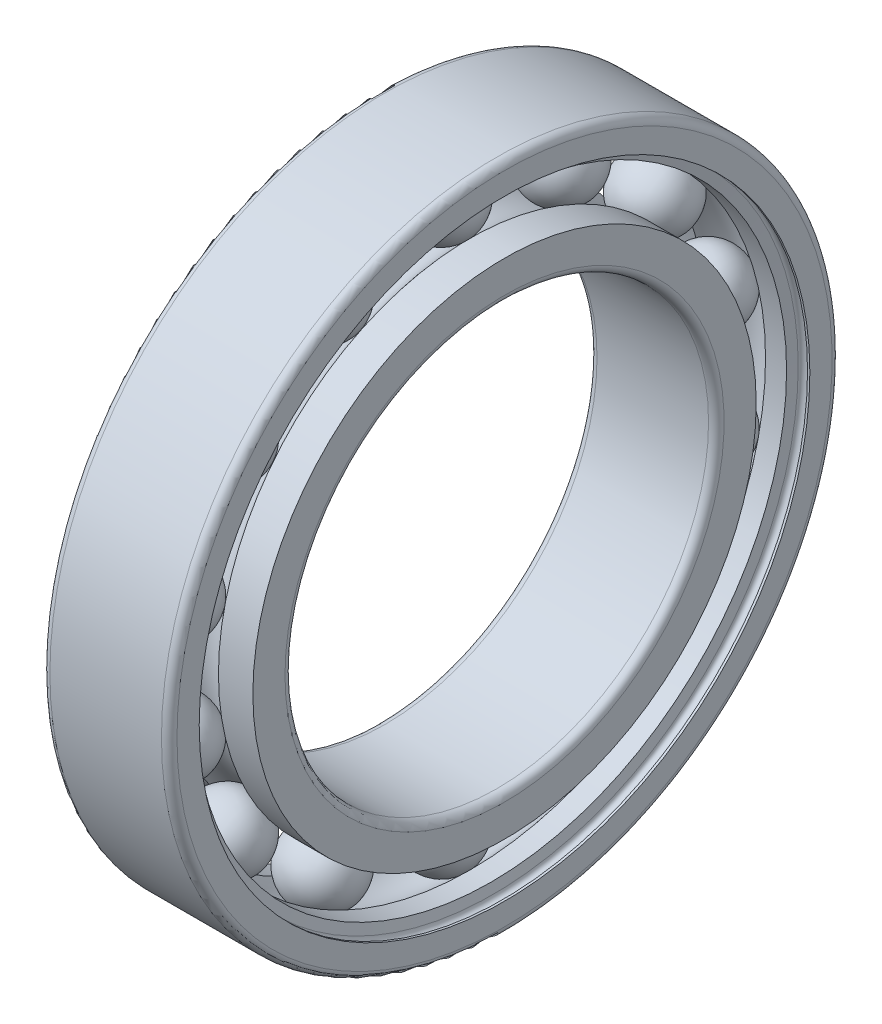
ISO-10303-21;
HEADER;
FILE_DESCRIPTION(('STEP AP214'),'2;1');
FILE_NAME('part.step','',(''),(''),'','','');
FILE_SCHEMA(('AUTOMOTIVE_DESIGN { 1 0 10303 214 1 1 1 1 }'));
ENDSEC;
DATA;
#1=APPLICATION_CONTEXT('core data for automotive mechanical design processes');
#2=APPLICATION_PROTOCOL_DEFINITION('international standard','automotive_design',2000,#1);
#3=PRODUCT_CONTEXT('',#1,'mechanical');
#4=PRODUCT('Part','Part','',(#3));
#5=PRODUCT_RELATED_PRODUCT_CATEGORY('part','',(#4));
#6=PRODUCT_DEFINITION_FORMATION('','',#4);
#7=PRODUCT_DEFINITION_CONTEXT('part definition',#1,'design');
#8=PRODUCT_DEFINITION('design','',#6,#7);
#9=PRODUCT_DEFINITION_SHAPE('','',#8);
#10=(LENGTH_UNIT() NAMED_UNIT(*) SI_UNIT(.MILLI.,.METRE.));
#11=(NAMED_UNIT(*) PLANE_ANGLE_UNIT() SI_UNIT($,.RADIAN.));
#12=(NAMED_UNIT(*) SI_UNIT($,.STERADIAN.) SOLID_ANGLE_UNIT());
#13=UNCERTAINTY_MEASURE_WITH_UNIT(LENGTH_MEASURE(1.E-05),#10,'distance_accuracy_value','');
#14=(GEOMETRIC_REPRESENTATION_CONTEXT(3) GLOBAL_UNCERTAINTY_ASSIGNED_CONTEXT((#13)) GLOBAL_UNIT_ASSIGNED_CONTEXT((#10,
#11,#12)) REPRESENTATION_CONTEXT('',''));
#15=CARTESIAN_POINT('',(0.,0.,0.));
#16=DIRECTION('',(0.,0.,1.));
#17=DIRECTION('',(1.,0.,0.));
#18=AXIS2_PLACEMENT_3D('',#15,#16,#17);
#19=CARTESIAN_POINT('',(1.10000000000035,0.,0.));
#20=DIRECTION('',(-1.,0.,0.));
#21=DIRECTION('',(0.,0.,1.));
#22=AXIS2_PLACEMENT_3D('',#19,#20,#21);
#23=TOROIDAL_SURFACE('',#22,31.1000000000003,1.10000000000035);
#24=CARTESIAN_POINT('',(1.1,0.,0.));
#25=DIRECTION('',(-1.,0.,0.));
#26=DIRECTION('',(0.,0.,1.));
#27=AXIS2_PLACEMENT_3D('',#24,#25,#26);
#28=CIRCLE('',#27,30.);
#29=CARTESIAN_POINT('',(1.1,0.,30.));
#30=VERTEX_POINT('',#29);
#31=EDGE_CURVE('P0_E10',#30,#30,#28,.T.);
#32=ORIENTED_EDGE('',*,*,#31,.F.);
#33=EDGE_LOOP('',(#32));
#34=FACE_BOUND('',#33,.T.);
#35=CARTESIAN_POINT('',(0.,0.,0.));
#36=DIRECTION('',(-1.,0.,0.));
#37=DIRECTION('',(0.,0.,1.));
#38=AXIS2_PLACEMENT_3D('',#35,#36,#37);
#39=CIRCLE('',#38,31.1);
#40=CARTESIAN_POINT('',(0.,0.,31.1));
#41=VERTEX_POINT('',#40);
#42=EDGE_CURVE('P0_E42',#41,#41,#39,.T.);
#43=ORIENTED_EDGE('',*,*,#42,.T.);
#44=EDGE_LOOP('',(#43));
#45=FACE_BOUND('',#44,.T.);
#46=ADVANCED_FACE('P0_F14',(#34,#45),#23,.T.);
#47=CARTESIAN_POINT('',(50.,0.,0.));
#48=DIRECTION('',(-1.,0.,0.));
#49=DIRECTION('',(0.,0.,1.));
#50=AXIS2_PLACEMENT_3D('',#47,#48,#49);
#51=CYLINDRICAL_SURFACE('',#50,30.);
#52=CARTESIAN_POINT('',(16.9,0.,0.));
#53=DIRECTION('',(-1.,0.,0.));
#54=DIRECTION('',(0.,0.,1.));
#55=AXIS2_PLACEMENT_3D('',#52,#53,#54);
#56=CIRCLE('',#55,30.);
#57=CARTESIAN_POINT('',(16.9,0.,30.));
#58=VERTEX_POINT('',#57);
#59=EDGE_CURVE('P0_E20',#58,#58,#56,.T.);
#60=ORIENTED_EDGE('',*,*,#59,.F.);
#61=EDGE_LOOP('',(#60));
#62=FACE_BOUND('',#61,.T.);
#63=ORIENTED_EDGE('',*,*,#31,.T.);
#64=EDGE_LOOP('',(#63));
#65=FACE_BOUND('',#64,.T.);
#66=ADVANCED_FACE('P0_F79',(#62,#65),#51,.F.);
#67=CARTESIAN_POINT('',(16.8999999999993,0.,0.));
#68=DIRECTION('',(-1.,0.,0.));
#69=DIRECTION('',(0.,0.,1.));
#70=AXIS2_PLACEMENT_3D('',#67,#68,#69);
#71=TOROIDAL_SURFACE('',#70,31.1000000000007,1.10000000000069);
#72=CARTESIAN_POINT('',(18.,0.,0.));
#73=DIRECTION('',(-1.,0.,0.));
#74=DIRECTION('',(0.,0.,1.));
#75=AXIS2_PLACEMENT_3D('',#72,#73,#74);
#76=CIRCLE('',#75,31.1);
#77=CARTESIAN_POINT('',(18.,0.,31.1));
#78=VERTEX_POINT('',#77);
#79=EDGE_CURVE('P0_E24',#78,#78,#76,.T.);
#80=ORIENTED_EDGE('',*,*,#79,.F.);
#81=EDGE_LOOP('',(#80));
#82=FACE_BOUND('',#81,.T.);
#83=ORIENTED_EDGE('',*,*,#59,.T.);
#84=EDGE_LOOP('',(#83));
#85=FACE_BOUND('',#84,.T.);
#86=ADVANCED_FACE('P0_F74',(#82,#85),#71,.T.);
#87=CARTESIAN_POINT('',(18.,31.1,0.));
#88=DIRECTION('',(-1.,0.,0.));
#89=DIRECTION('',(0.,0.,1.));
#90=AXIS2_PLACEMENT_3D('',#87,#88,#89);
#91=PLANE('',#90);
#92=CARTESIAN_POINT('',(18.,0.,0.));
#93=DIRECTION('',(-1.,0.,0.));
#94=DIRECTION('',(0.,0.,1.));
#95=AXIS2_PLACEMENT_3D('',#92,#93,#94);
#96=CIRCLE('',#95,35.65);
#97=CARTESIAN_POINT('',(18.,0.,35.65));
#98=VERTEX_POINT('',#97);
#99=EDGE_CURVE('P0_E28',#98,#98,#96,.T.);
#100=ORIENTED_EDGE('',*,*,#99,.F.);
#101=EDGE_LOOP('',(#100));
#102=FACE_BOUND('',#101,.T.);
#103=ORIENTED_EDGE('',*,*,#79,.T.);
#104=EDGE_LOOP('',(#103));
#105=FACE_BOUND('',#104,.T.);
#106=ADVANCED_FACE('P0_F68',(#102,#105),#91,.F.);
#107=CARTESIAN_POINT('',(50.,0.,0.));
#108=DIRECTION('',(-1.,0.,0.));
#109=DIRECTION('',(0.,0.,1.));
#110=AXIS2_PLACEMENT_3D('',#107,#108,#109);
#111=CYLINDRICAL_SURFACE('',#110,35.65);
#112=CARTESIAN_POINT('',(13.124371497574,0.,0.));
#113=DIRECTION('',(-1.,0.,0.));
#114=DIRECTION('',(0.,0.,1.));
#115=AXIS2_PLACEMENT_3D('',#112,#113,#114);
#116=CIRCLE('',#115,35.65);
#117=CARTESIAN_POINT('',(13.124371497574,0.,35.65));
#118=VERTEX_POINT('',#117);
#119=EDGE_CURVE('P0_E33',#118,#118,#116,.T.);
#120=ORIENTED_EDGE('',*,*,#119,.F.);
#121=EDGE_LOOP('',(#120));
#122=FACE_BOUND('',#121,.T.);
#123=ORIENTED_EDGE('',*,*,#99,.T.);
#124=EDGE_LOOP('',(#123));
#125=FACE_BOUND('',#124,.T.);
#126=ADVANCED_FACE('P0_F62',(#122,#125),#111,.T.);
#127=CARTESIAN_POINT('',(9.00000000000005,0.,0.));
#128=DIRECTION('',(-1.,0.,0.));
#129=DIRECTION('',(0.,0.,1.));
#130=AXIS2_PLACEMENT_3D('',#127,#128,#129);
#131=TOROIDAL_SURFACE('',#130,38.7500000000001,5.1595000000001);
#132=CARTESIAN_POINT('',(4.8756285024261,0.,0.));
#133=DIRECTION('',(-1.,0.,0.));
#134=DIRECTION('',(0.,0.,1.));
#135=AXIS2_PLACEMENT_3D('',#132,#133,#134);
#136=CIRCLE('',#135,35.65);
#137=CARTESIAN_POINT('',(4.8756285024261,0.,35.65));
#138=VERTEX_POINT('',#137);
#139=EDGE_CURVE('P0_E36',#138,#138,#136,.T.);
#140=ORIENTED_EDGE('',*,*,#139,.F.);
#141=EDGE_LOOP('',(#140));
#142=FACE_BOUND('',#141,.T.);
#143=ORIENTED_EDGE('',*,*,#119,.T.);
#144=EDGE_LOOP('',(#143));
#145=FACE_BOUND('',#144,.T.);
#146=ADVANCED_FACE('P0_F56',(#142,#145),#131,.F.);
#147=CARTESIAN_POINT('',(50.,0.,0.));
#148=DIRECTION('',(-1.,0.,0.));
#149=DIRECTION('',(0.,0.,1.));
#150=AXIS2_PLACEMENT_3D('',#147,#148,#149);
#151=CYLINDRICAL_SURFACE('',#150,35.65);
#152=CARTESIAN_POINT('',(0.,0.,0.));
#153=DIRECTION('',(-1.,0.,0.));
#154=DIRECTION('',(0.,0.,1.));
#155=AXIS2_PLACEMENT_3D('',#152,#153,#154);
#156=CIRCLE('',#155,35.65);
#157=CARTESIAN_POINT('',(0.,0.,35.65));
#158=VERTEX_POINT('',#157);
#159=EDGE_CURVE('P0_E39',#158,#158,#156,.T.);
#160=ORIENTED_EDGE('',*,*,#159,.F.);
#161=EDGE_LOOP('',(#160));
#162=FACE_BOUND('',#161,.T.);
#163=ORIENTED_EDGE('',*,*,#139,.T.);
#164=EDGE_LOOP('',(#163));
#165=FACE_BOUND('',#164,.T.);
#166=ADVANCED_FACE('P0_F50',(#162,#165),#151,.T.);
#167=CARTESIAN_POINT('',(0.,35.65,0.));
#168=DIRECTION('',(1.,0.,0.));
#169=DIRECTION('',(0.,0.,-1.));
#170=AXIS2_PLACEMENT_3D('',#167,#168,#169);
#171=PLANE('',#170);
#172=ORIENTED_EDGE('',*,*,#42,.F.);
#173=EDGE_LOOP('',(#172));
#174=FACE_BOUND('',#173,.T.);
#175=ORIENTED_EDGE('',*,*,#159,.T.);
#176=EDGE_LOOP('',(#175));
#177=FACE_BOUND('',#176,.T.);
#178=ADVANCED_FACE('P0_F47',(#174,#177),#171,.F.);
#179=CLOSED_SHELL('',(#46,#66,#86,#106,#126,#146,#166,#178));
#180=MANIFOLD_SOLID_BREP('P0_B1',#179);
#181=CARTESIAN_POINT('',(0.,46.4000000000003,0.));
#182=DIRECTION('',(1.,0.,0.));
#183=DIRECTION('',(0.,0.,-1.00000000000001));
#184=AXIS2_PLACEMENT_3D('',#181,#182,#183);
#185=PLANE('',#184);
#186=CARTESIAN_POINT('',(0.,0.,0.));
#187=DIRECTION('',(-1.,0.,0.));
#188=DIRECTION('',(0.,0.,1.00000000000001));
#189=AXIS2_PLACEMENT_3D('',#186,#187,#188);
#190=CIRCLE('',#189,43.25);
#191=CARTESIAN_POINT('',(0.,0.,43.2500000000003));
#192=VERTEX_POINT('',#191);
#193=EDGE_CURVE('P1_E60',#192,#192,#190,.T.);
#194=ORIENTED_EDGE('',*,*,#193,.F.);
#195=EDGE_LOOP('',(#194));
#196=FACE_BOUND('',#195,.T.);
#197=CARTESIAN_POINT('',(0.,0.,0.));
#198=DIRECTION('',(-1.,0.,0.));
#199=DIRECTION('',(0.,0.,1.00000000000001));
#200=AXIS2_PLACEMENT_3D('',#197,#198,#199);
#201=CIRCLE('',#200,46.4);
#202=CARTESIAN_POINT('',(0.,0.,46.4000000000003));
#203=VERTEX_POINT('',#202);
#204=EDGE_CURVE('P1_E10',#203,#203,#201,.T.);
#205=ORIENTED_EDGE('',*,*,#204,.T.);
#206=EDGE_LOOP('',(#205));
#207=FACE_BOUND('',#206,.T.);
#208=ADVANCED_FACE('P1_F14',(#196,#207),#185,.F.);
#209=CARTESIAN_POINT('',(1.10000000000032,0.,0.));
#210=DIRECTION('',(-1.,0.,0.));
#211=DIRECTION('',(0.,0.,1.00000000000001));
#212=AXIS2_PLACEMENT_3D('',#209,#210,#211);
#213=TOROIDAL_SURFACE('',#212,46.3999999999997,1.10000000000035);
#214=ORIENTED_EDGE('',*,*,#204,.F.);
#215=EDGE_LOOP('',(#214));
#216=FACE_BOUND('',#215,.T.);
#217=CARTESIAN_POINT('',(1.09999999999999,0.,0.));
#218=DIRECTION('',(-1.,0.,0.));
#219=DIRECTION('',(0.,0.,1.00000000000001));
#220=AXIS2_PLACEMENT_3D('',#217,#218,#219);
#221=CIRCLE('',#220,47.5);
#222=CARTESIAN_POINT('',(1.09999999999999,0.,47.5000000000003));
#223=VERTEX_POINT('',#222);
#224=EDGE_CURVE('P1_E20',#223,#223,#221,.T.);
#225=ORIENTED_EDGE('',*,*,#224,.T.);
#226=EDGE_LOOP('',(#225));
#227=FACE_BOUND('',#226,.T.);
#228=ADVANCED_FACE('P1_F67',(#216,#227),#213,.T.);
#229=CARTESIAN_POINT('',(50.,0.,0.));
#230=DIRECTION('',(-1.,0.,0.));
#231=DIRECTION('',(0.,0.,1.00000000000001));
#232=AXIS2_PLACEMENT_3D('',#229,#230,#231);
#233=CYLINDRICAL_SURFACE('',#232,47.5);
#234=ORIENTED_EDGE('',*,*,#224,.F.);
#235=EDGE_LOOP('',(#234));
#236=FACE_BOUND('',#235,.T.);
#237=CARTESIAN_POINT('',(16.9,0.,0.));
#238=DIRECTION('',(-1.,0.,0.));
#239=DIRECTION('',(0.,0.,1.00000000000001));
#240=AXIS2_PLACEMENT_3D('',#237,#238,#239);
#241=CIRCLE('',#240,47.5);
#242=CARTESIAN_POINT('',(16.9,0.,47.5000000000003));
#243=VERTEX_POINT('',#242);
#244=EDGE_CURVE('P1_E24',#243,#243,#241,.T.);
#245=ORIENTED_EDGE('',*,*,#244,.T.);
#246=EDGE_LOOP('',(#245));
#247=FACE_BOUND('',#246,.T.);
#248=ADVANCED_FACE('P1_F72',(#236,#247),#233,.T.);
#249=CARTESIAN_POINT('',(16.8999999999992,0.,0.));
#250=DIRECTION('',(-1.,0.,0.));
#251=DIRECTION('',(0.,0.,1.00000000000001));
#252=AXIS2_PLACEMENT_3D('',#249,#250,#251);
#253=TOROIDAL_SURFACE('',#252,46.3999999999993,1.1000000000007);
#254=ORIENTED_EDGE('',*,*,#244,.F.);
#255=EDGE_LOOP('',(#254));
#256=FACE_BOUND('',#255,.T.);
#257=CARTESIAN_POINT('',(18.,0.,0.));
#258=DIRECTION('',(-1.,0.,0.));
#259=DIRECTION('',(0.,0.,1.00000000000001));
#260=AXIS2_PLACEMENT_3D('',#257,#258,#259);
#261=CIRCLE('',#260,46.4);
#262=CARTESIAN_POINT('',(18.,0.,46.4000000000003));
#263=VERTEX_POINT('',#262);
#264=EDGE_CURVE('P1_E28',#263,#263,#261,.T.);
#265=ORIENTED_EDGE('',*,*,#264,.T.);
#266=EDGE_LOOP('',(#265));
#267=FACE_BOUND('',#266,.T.);
#268=ADVANCED_FACE('P1_F77',(#256,#267),#253,.T.);
#269=CARTESIAN_POINT('',(18.,43.2500000000002,0.));
#270=DIRECTION('',(-1.,0.,0.));
#271=DIRECTION('',(0.,0.,1.00000000000001));
#272=AXIS2_PLACEMENT_3D('',#269,#270,#271);
#273=PLANE('',#272);
#274=ORIENTED_EDGE('',*,*,#264,.F.);
#275=EDGE_LOOP('',(#274));
#276=FACE_BOUND('',#275,.T.);
#277=CARTESIAN_POINT('',(18.,0.,0.));
#278=DIRECTION('',(-1.,0.,0.));
#279=DIRECTION('',(0.,0.,1.00000000000001));
#280=AXIS2_PLACEMENT_3D('',#277,#278,#279);
#281=CIRCLE('',#280,43.25);
#282=CARTESIAN_POINT('',(18.,0.,43.2500000000003));
#283=VERTEX_POINT('',#282);
#284=EDGE_CURVE('P1_E33',#283,#283,#281,.T.);
#285=ORIENTED_EDGE('',*,*,#284,.T.);
#286=EDGE_LOOP('',(#285));
#287=FACE_BOUND('',#286,.T.);
#288=ADVANCED_FACE('P1_F83',(#276,#287),#273,.F.);
#289=CARTESIAN_POINT('',(50.,0.,0.));
#290=DIRECTION('',(-1.,0.,0.));
#291=DIRECTION('',(0.,0.,1.00000000000001));
#292=AXIS2_PLACEMENT_3D('',#289,#290,#291);
#293=CYLINDRICAL_SURFACE('',#292,43.25);
#294=ORIENTED_EDGE('',*,*,#284,.F.);
#295=EDGE_LOOP('',(#294));
#296=FACE_BOUND('',#295,.T.);
#297=CARTESIAN_POINT('',(17.6700000000001,0.,0.));
#298=DIRECTION('',(-1.,0.,0.));
#299=DIRECTION('',(0.,0.,1.00000000000001));
#300=AXIS2_PLACEMENT_3D('',#297,#298,#299);
#301=CIRCLE('',#300,43.25);
#302=CARTESIAN_POINT('',(17.6700000000001,0.,43.2500000000003));
#303=VERTEX_POINT('',#302);
#304=EDGE_CURVE('P1_E36',#303,#303,#301,.T.);
#305=ORIENTED_EDGE('',*,*,#304,.T.);
#306=EDGE_LOOP('',(#305));
#307=FACE_BOUND('',#306,.T.);
#308=ADVANCED_FACE('P1_F87',(#296,#307),#293,.F.);
#309=CARTESIAN_POINT('',(17.01,0.,0.));
#310=DIRECTION('',(-1.,0.,0.));
#311=DIRECTION('',(0.,0.,1.00000000000001));
#312=AXIS2_PLACEMENT_3D('',#309,#310,#311);
#313=TOROIDAL_SURFACE('',#312,43.25,0.660000000000001);
#314=ORIENTED_EDGE('',*,*,#304,.F.);
#315=EDGE_LOOP('',(#314));
#316=FACE_BOUND('',#315,.T.);
#317=CARTESIAN_POINT('',(16.35,0.,0.));
#318=DIRECTION('',(-1.,0.,0.));
#319=DIRECTION('',(0.,0.,1.00000000000001));
#320=AXIS2_PLACEMENT_3D('',#317,#318,#319);
#321=CIRCLE('',#320,43.25);
#322=CARTESIAN_POINT('',(16.35,0.,43.2500000000003));
#323=VERTEX_POINT('',#322);
#324=EDGE_CURVE('P1_E39',#323,#323,#321,.T.);
#325=ORIENTED_EDGE('',*,*,#324,.T.);
#326=EDGE_LOOP('',(#325));
#327=FACE_BOUND('',#326,.T.);
#328=ADVANCED_FACE('P1_F91',(#316,#327),#313,.F.);
#329=CARTESIAN_POINT('',(16.1031422270079,0.,0.));
#330=DIRECTION('',(1.,0.,0.));
#331=DIRECTION('',(0.,0.,-1.00000000000001));
#332=AXIS2_PLACEMENT_3D('',#329,#330,#331);
#333=CONICAL_SURFACE('',#332,41.85,1.39626340159536);
#334=ORIENTED_EDGE('',*,*,#324,.F.);
#335=EDGE_LOOP('',(#334));
#336=FACE_BOUND('',#335,.T.);
#337=CARTESIAN_POINT('',(16.1031422270079,0.,0.));
#338=DIRECTION('',(-1.,0.,0.));
#339=DIRECTION('',(0.,0.,1.00000000000001));
#340=AXIS2_PLACEMENT_3D('',#337,#338,#339);
#341=CIRCLE('',#340,41.85);
#342=CARTESIAN_POINT('',(16.1031422270079,0.,41.8500000000003));
#343=VERTEX_POINT('',#342);
#344=EDGE_CURVE('P1_E42',#343,#343,#341,.T.);
#345=ORIENTED_EDGE('',*,*,#344,.T.);
#346=EDGE_LOOP('',(#345));
#347=FACE_BOUND('',#346,.T.);
#348=ADVANCED_FACE('P1_F95',(#336,#347),#333,.F.);
#349=CARTESIAN_POINT('',(50.,0.,0.));
#350=DIRECTION('',(-1.,0.,0.));
#351=DIRECTION('',(0.,0.,1.00000000000001));
#352=AXIS2_PLACEMENT_3D('',#349,#350,#351);
#353=CYLINDRICAL_SURFACE('',#352,41.85);
#354=ORIENTED_EDGE('',*,*,#344,.F.);
#355=EDGE_LOOP('',(#354));
#356=FACE_BOUND('',#355,.T.);
#357=CARTESIAN_POINT('',(13.124371497574,0.,0.));
#358=DIRECTION('',(-1.,0.,0.));
#359=DIRECTION('',(0.,0.,1.00000000000001));
#360=AXIS2_PLACEMENT_3D('',#357,#358,#359);
#361=CIRCLE('',#360,41.85);
#362=CARTESIAN_POINT('',(13.124371497574,0.,41.8500000000003));
#363=VERTEX_POINT('',#362);
#364=EDGE_CURVE('P1_E45',#363,#363,#361,.T.);
#365=ORIENTED_EDGE('',*,*,#364,.T.);
#366=EDGE_LOOP('',(#365));
#367=FACE_BOUND('',#366,.T.);
#368=ADVANCED_FACE('P1_F99',(#356,#367),#353,.F.);
#369=CARTESIAN_POINT('',(9.00000000000012,0.,0.));
#370=DIRECTION('',(-1.,0.,0.));
#371=DIRECTION('',(0.,0.,1.00000000000001));
#372=AXIS2_PLACEMENT_3D('',#369,#370,#371);
#373=TOROIDAL_SURFACE('',#372,38.7499999999999,5.1595000000001);
#374=ORIENTED_EDGE('',*,*,#364,.F.);
#375=EDGE_LOOP('',(#374));
#376=FACE_BOUND('',#375,.T.);
#377=CARTESIAN_POINT('',(4.87562850242607,0.,0.));
#378=DIRECTION('',(-1.,0.,0.));
#379=DIRECTION('',(0.,0.,1.00000000000001));
#380=AXIS2_PLACEMENT_3D('',#377,#378,#379);
#381=CIRCLE('',#380,41.85);
#382=CARTESIAN_POINT('',(4.87562850242607,0.,41.8500000000003));
#383=VERTEX_POINT('',#382);
#384=EDGE_CURVE('P1_E48',#383,#383,#381,.T.);
#385=ORIENTED_EDGE('',*,*,#384,.T.);
#386=EDGE_LOOP('',(#385));
#387=FACE_BOUND('',#386,.T.);
#388=ADVANCED_FACE('P1_F103',(#376,#387),#373,.F.);
#389=CARTESIAN_POINT('',(50.,0.,0.));
#390=DIRECTION('',(-1.,0.,0.));
#391=DIRECTION('',(0.,0.,1.00000000000001));
#392=AXIS2_PLACEMENT_3D('',#389,#390,#391);
#393=CYLINDRICAL_SURFACE('',#392,41.85);
#394=ORIENTED_EDGE('',*,*,#384,.F.);
#395=EDGE_LOOP('',(#394));
#396=FACE_BOUND('',#395,.T.);
#397=CARTESIAN_POINT('',(1.89685777299187,0.,0.));
#398=DIRECTION('',(-1.,0.,0.));
#399=DIRECTION('',(0.,0.,1.00000000000001));
#400=AXIS2_PLACEMENT_3D('',#397,#398,#399);
#401=CIRCLE('',#400,41.85);
#402=CARTESIAN_POINT('',(1.89685777299187,0.,41.8500000000003));
#403=VERTEX_POINT('',#402);
#404=EDGE_CURVE('P1_E51',#403,#403,#401,.T.);
#405=ORIENTED_EDGE('',*,*,#404,.T.);
#406=EDGE_LOOP('',(#405));
#407=FACE_BOUND('',#406,.T.);
#408=ADVANCED_FACE('P1_F107',(#396,#407),#393,.F.);
#409=CARTESIAN_POINT('',(1.64999999999993,0.,0.));
#410=DIRECTION('',(-1.,0.,0.));
#411=DIRECTION('',(0.,0.,1.00000000000001));
#412=AXIS2_PLACEMENT_3D('',#409,#410,#411);
#413=CONICAL_SURFACE('',#412,43.25,1.39626340159543);
#414=ORIENTED_EDGE('',*,*,#404,.F.);
#415=EDGE_LOOP('',(#414));
#416=FACE_BOUND('',#415,.T.);
#417=CARTESIAN_POINT('',(1.64999999999993,0.,0.));
#418=DIRECTION('',(-1.,0.,0.));
#419=DIRECTION('',(0.,0.,1.00000000000001));
#420=AXIS2_PLACEMENT_3D('',#417,#418,#419);
#421=CIRCLE('',#420,43.25);
#422=CARTESIAN_POINT('',(1.64999999999993,0.,43.2500000000003));
#423=VERTEX_POINT('',#422);
#424=EDGE_CURVE('P1_E54',#423,#423,#421,.T.);
#425=ORIENTED_EDGE('',*,*,#424,.T.);
#426=EDGE_LOOP('',(#425));
#427=FACE_BOUND('',#426,.T.);
#428=ADVANCED_FACE('P1_F111',(#416,#427),#413,.F.);
#429=CARTESIAN_POINT('',(0.990000000000046,0.,0.));
#430=DIRECTION('',(-1.,0.,0.));
#431=DIRECTION('',(0.,0.,1.00000000000001));
#432=AXIS2_PLACEMENT_3D('',#429,#430,#431);
#433=TOROIDAL_SURFACE('',#432,43.24999998334,0.66);
#434=ORIENTED_EDGE('',*,*,#424,.F.);
#435=EDGE_LOOP('',(#434));
#436=FACE_BOUND('',#435,.T.);
#437=CARTESIAN_POINT('',(0.329999999999941,0.,0.));
#438=DIRECTION('',(-1.,0.,0.));
#439=DIRECTION('',(0.,0.,1.00000000000001));
#440=AXIS2_PLACEMENT_3D('',#437,#438,#439);
#441=CIRCLE('',#440,43.25);
#442=CARTESIAN_POINT('',(0.329999999999941,0.,43.2500000000003));
#443=VERTEX_POINT('',#442);
#444=EDGE_CURVE('P1_E57',#443,#443,#441,.T.);
#445=ORIENTED_EDGE('',*,*,#444,.T.);
#446=EDGE_LOOP('',(#445));
#447=FACE_BOUND('',#446,.T.);
#448=ADVANCED_FACE('P1_F115',(#436,#447),#433,.F.);
#449=CARTESIAN_POINT('',(50.,0.,0.));
#450=DIRECTION('',(-1.,0.,0.));
#451=DIRECTION('',(0.,0.,1.00000000000001));
#452=AXIS2_PLACEMENT_3D('',#449,#450,#451);
#453=CYLINDRICAL_SURFACE('',#452,43.25);
#454=ORIENTED_EDGE('',*,*,#444,.F.);
#455=EDGE_LOOP('',(#454));
#456=FACE_BOUND('',#455,.T.);
#457=ORIENTED_EDGE('',*,*,#193,.T.);
#458=EDGE_LOOP('',(#457));
#459=FACE_BOUND('',#458,.T.);
#460=ADVANCED_FACE('P1_F64',(#456,#459),#453,.F.);
#461=CLOSED_SHELL('',(#208,#228,#248,#268,#288,#308,#328,#348,#368,#388,#408,#428,#448,#460));
#462=MANIFOLD_SOLID_BREP('P1_B1',#461);
#463=CARTESIAN_POINT('',(9.,38.75,0.));
#464=DIRECTION('',(-1.,0.,0.));
#465=DIRECTION('',(0.,1.,0.));
#466=AXIS2_PLACEMENT_3D('',#463,#464,#465);
#467=SPHERICAL_SURFACE('',#466,5.1595);
#468=CARTESIAN_POINT('',(3.8405,38.75,0.));
#469=VERTEX_POINT('',#468);
#470=VERTEX_LOOP('',#469);
#471=FACE_BOUND('',#470,.T.);
#472=ADVANCED_FACE('P2_F12',(#471),#467,.T.);
#473=CLOSED_SHELL('',(#472));
#474=MANIFOLD_SOLID_BREP('P2_B1',#473);
#475=CARTESIAN_POINT('',(9.,-24.1602298220258,30.2959699456362));
#476=DIRECTION('',(-1.,0.,0.));
#477=DIRECTION('',(0.,-0.623489801858731,0.781831482468032));
#478=AXIS2_PLACEMENT_3D('',#475,#476,#477);
#479=SPHERICAL_SURFACE('',#478,5.1595);
#480=CARTESIAN_POINT('',(3.8405,-24.1602298220258,30.2959699456362));
#481=VERTEX_POINT('',#480);
#482=VERTEX_LOOP('',#481);
#483=FACE_BOUND('',#482,.T.);
#484=ADVANCED_FACE('P3_F12',(#483),#479,.T.);
#485=CLOSED_SHELL('',(#484));
#486=MANIFOLD_SOLID_BREP('P3_B1',#485);
#487=CARTESIAN_POINT('',(9.,-8.62268619080705,37.7784565970457));
#488=DIRECTION('',(-1.,0.,0.));
#489=DIRECTION('',(0.,-0.222520933956311,0.974927912181824));
#490=AXIS2_PLACEMENT_3D('',#487,#488,#489);
#491=SPHERICAL_SURFACE('',#490,5.1595);
#492=CARTESIAN_POINT('',(3.8405,-8.62268619080705,37.7784565970457));
#493=VERTEX_POINT('',#492);
#494=VERTEX_LOOP('',#493);
#495=FACE_BOUND('',#494,.T.);
#496=ADVANCED_FACE('P4_F12',(#495),#491,.T.);
#497=CLOSED_SHELL('',(#496));
#498=MANIFOLD_SOLID_BREP('P4_B1',#497);
#499=CARTESIAN_POINT('',(9.,8.62268619080742,37.7784565970456));
#500=DIRECTION('',(-1.,0.,0.));
#501=DIRECTION('',(0.,0.22252093395632,0.974927912181822));
#502=AXIS2_PLACEMENT_3D('',#499,#500,#501);
#503=SPHERICAL_SURFACE('',#502,5.1595);
#504=CARTESIAN_POINT('',(3.8405,8.62268619080742,37.7784565970456));
#505=VERTEX_POINT('',#504);
#506=VERTEX_LOOP('',#505);
#507=FACE_BOUND('',#506,.T.);
#508=ADVANCED_FACE('P5_F12',(#507),#503,.T.);
#509=CLOSED_SHELL('',(#508));
#510=MANIFOLD_SOLID_BREP('P5_B1',#509);
#511=CARTESIAN_POINT('',(9.,24.1602298220258,30.2959699456362));
#512=DIRECTION('',(-1.,0.,0.));
#513=DIRECTION('',(0.,0.623489801858731,0.781831482468032));
#514=AXIS2_PLACEMENT_3D('',#511,#512,#513);
#515=SPHERICAL_SURFACE('',#514,5.1595);
#516=CARTESIAN_POINT('',(3.8405,24.1602298220258,30.2959699456362));
#517=VERTEX_POINT('',#516);
#518=VERTEX_LOOP('',#517);
#519=FACE_BOUND('',#518,.T.);
#520=ADVANCED_FACE('P6_F12',(#519),#515,.T.);
#521=CLOSED_SHELL('',(#520));
#522=MANIFOLD_SOLID_BREP('P6_B1',#521);
#523=CARTESIAN_POINT('',(9.,34.9125436312187,16.8129948908054));
#524=DIRECTION('',(-1.,0.,0.));
#525=DIRECTION('',(0.,0.900968867902419,0.433883739117559));
#526=AXIS2_PLACEMENT_3D('',#523,#524,#525);
#527=SPHERICAL_SURFACE('',#526,5.1595);
#528=CARTESIAN_POINT('',(3.8405,34.9125436312187,16.8129948908054));
#529=VERTEX_POINT('',#528);
#530=VERTEX_LOOP('',#529);
#531=FACE_BOUND('',#530,.T.);
#532=ADVANCED_FACE('P7_F12',(#531),#527,.T.);
#533=CLOSED_SHELL('',(#532));
#534=MANIFOLD_SOLID_BREP('P7_B1',#533);
#535=CARTESIAN_POINT('',(9.,34.9125436312187,-16.8129948908054));
#536=DIRECTION('',(-1.,0.,0.));
#537=DIRECTION('',(0.,0.900968867902419,-0.433883739117559));
#538=AXIS2_PLACEMENT_3D('',#535,#536,#537);
#539=SPHERICAL_SURFACE('',#538,5.1595);
#540=CARTESIAN_POINT('',(3.8405,34.9125436312187,-16.8129948908054));
#541=VERTEX_POINT('',#540);
#542=VERTEX_LOOP('',#541);
#543=FACE_BOUND('',#542,.T.);
#544=ADVANCED_FACE('P8_F12',(#543),#539,.T.);
#545=CLOSED_SHELL('',(#544));
#546=MANIFOLD_SOLID_BREP('P8_B1',#545);
#547=CARTESIAN_POINT('',(9.,24.1602298220258,-30.2959699456362));
#548=DIRECTION('',(-1.,0.,0.));
#549=DIRECTION('',(0.,0.623489801858731,-0.781831482468032));
#550=AXIS2_PLACEMENT_3D('',#547,#548,#549);
#551=SPHERICAL_SURFACE('',#550,5.1595);
#552=CARTESIAN_POINT('',(3.8405,24.1602298220258,-30.2959699456362));
#553=VERTEX_POINT('',#552);
#554=VERTEX_LOOP('',#553);
#555=FACE_BOUND('',#554,.T.);
#556=ADVANCED_FACE('P9_F12',(#555),#551,.T.);
#557=CLOSED_SHELL('',(#556));
#558=MANIFOLD_SOLID_BREP('P9_B1',#557);
#559=CARTESIAN_POINT('',(9.,8.62268619080705,-37.7784565970457));
#560=DIRECTION('',(-1.,0.,0.));
#561=DIRECTION('',(0.,0.222520933956311,-0.974927912181824));
#562=AXIS2_PLACEMENT_3D('',#559,#560,#561);
#563=SPHERICAL_SURFACE('',#562,5.1595);
#564=CARTESIAN_POINT('',(3.8405,8.62268619080705,-37.7784565970457));
#565=VERTEX_POINT('',#564);
#566=VERTEX_LOOP('',#565);
#567=FACE_BOUND('',#566,.T.);
#568=ADVANCED_FACE('P10_F12',(#567),#563,.T.);
#569=CLOSED_SHELL('',(#568));
#570=MANIFOLD_SOLID_BREP('P10_B1',#569);
#571=CARTESIAN_POINT('',(9.,-8.62268619080705,-37.7784565970457));
#572=DIRECTION('',(-1.,0.,0.));
#573=DIRECTION('',(0.,-0.222520933956311,-0.974927912181824));
#574=AXIS2_PLACEMENT_3D('',#571,#572,#573);
#575=SPHERICAL_SURFACE('',#574,5.1595);
#576=CARTESIAN_POINT('',(3.8405,-8.62268619080705,-37.7784565970457));
#577=VERTEX_POINT('',#576);
#578=VERTEX_LOOP('',#577);
#579=FACE_BOUND('',#578,.T.);
#580=ADVANCED_FACE('P11_F12',(#579),#575,.T.);
#581=CLOSED_SHELL('',(#580));
#582=MANIFOLD_SOLID_BREP('P11_B1',#581);
#583=CARTESIAN_POINT('',(9.,-24.1602298220258,-30.2959699456362));
#584=DIRECTION('',(-1.,0.,0.));
#585=DIRECTION('',(0.,-0.623489801858731,-0.781831482468032));
#586=AXIS2_PLACEMENT_3D('',#583,#584,#585);
#587=SPHERICAL_SURFACE('',#586,5.1595);
#588=CARTESIAN_POINT('',(3.8405,-24.1602298220258,-30.2959699456362));
#589=VERTEX_POINT('',#588);
#590=VERTEX_LOOP('',#589);
#591=FACE_BOUND('',#590,.T.);
#592=ADVANCED_FACE('P12_F12',(#591),#587,.T.);
#593=CLOSED_SHELL('',(#592));
#594=MANIFOLD_SOLID_BREP('P12_B1',#593);
#595=CARTESIAN_POINT('',(9.,-34.9125436312187,-16.8129948908054));
#596=DIRECTION('',(-1.,0.,0.));
#597=DIRECTION('',(0.,-0.900968867902419,-0.433883739117559));
#598=AXIS2_PLACEMENT_3D('',#595,#596,#597);
#599=SPHERICAL_SURFACE('',#598,5.1595);
#600=CARTESIAN_POINT('',(3.8405,-34.9125436312187,-16.8129948908054));
#601=VERTEX_POINT('',#600);
#602=VERTEX_LOOP('',#601);
#603=FACE_BOUND('',#602,.T.);
#604=ADVANCED_FACE('P13_F12',(#603),#599,.T.);
#605=CLOSED_SHELL('',(#604));
#606=MANIFOLD_SOLID_BREP('P13_B1',#605);
#607=CARTESIAN_POINT('',(9.,-38.75,0.));
#608=DIRECTION('',(-1.,0.,0.));
#609=DIRECTION('',(0.,-1.,0.));
#610=AXIS2_PLACEMENT_3D('',#607,#608,#609);
#611=SPHERICAL_SURFACE('',#610,5.1595);
#612=CARTESIAN_POINT('',(3.8405,-38.75,0.));
#613=VERTEX_POINT('',#612);
#614=VERTEX_LOOP('',#613);
#615=FACE_BOUND('',#614,.T.);
#616=ADVANCED_FACE('P14_F12',(#615),#611,.T.);
#617=CLOSED_SHELL('',(#616));
#618=MANIFOLD_SOLID_BREP('P14_B1',#617);
#619=CARTESIAN_POINT('',(9.,-34.9125436312187,16.8129948908054));
#620=DIRECTION('',(-1.,0.,0.));
#621=DIRECTION('',(0.,-0.900968867902419,0.433883739117559));
#622=AXIS2_PLACEMENT_3D('',#619,#620,#621);
#623=SPHERICAL_SURFACE('',#622,5.1595);
#624=CARTESIAN_POINT('',(3.8405,-34.9125436312187,16.8129948908054));
#625=VERTEX_POINT('',#624);
#626=VERTEX_LOOP('',#625);
#627=FACE_BOUND('',#626,.T.);
#628=ADVANCED_FACE('P15_F12',(#627),#623,.T.);
#629=CLOSED_SHELL('',(#628));
#630=MANIFOLD_SOLID_BREP('P15_B1',#629);
#631=ADVANCED_BREP_SHAPE_REPRESENTATION('',(#18,#180,#462,#474,#486,#498,#510,#522,#534,#546,
#558,#570,#582,#594,#606,#618,#630),#14);
#632=SHAPE_DEFINITION_REPRESENTATION(#9,#631);
ENDSEC;
END-ISO-10303-21;
